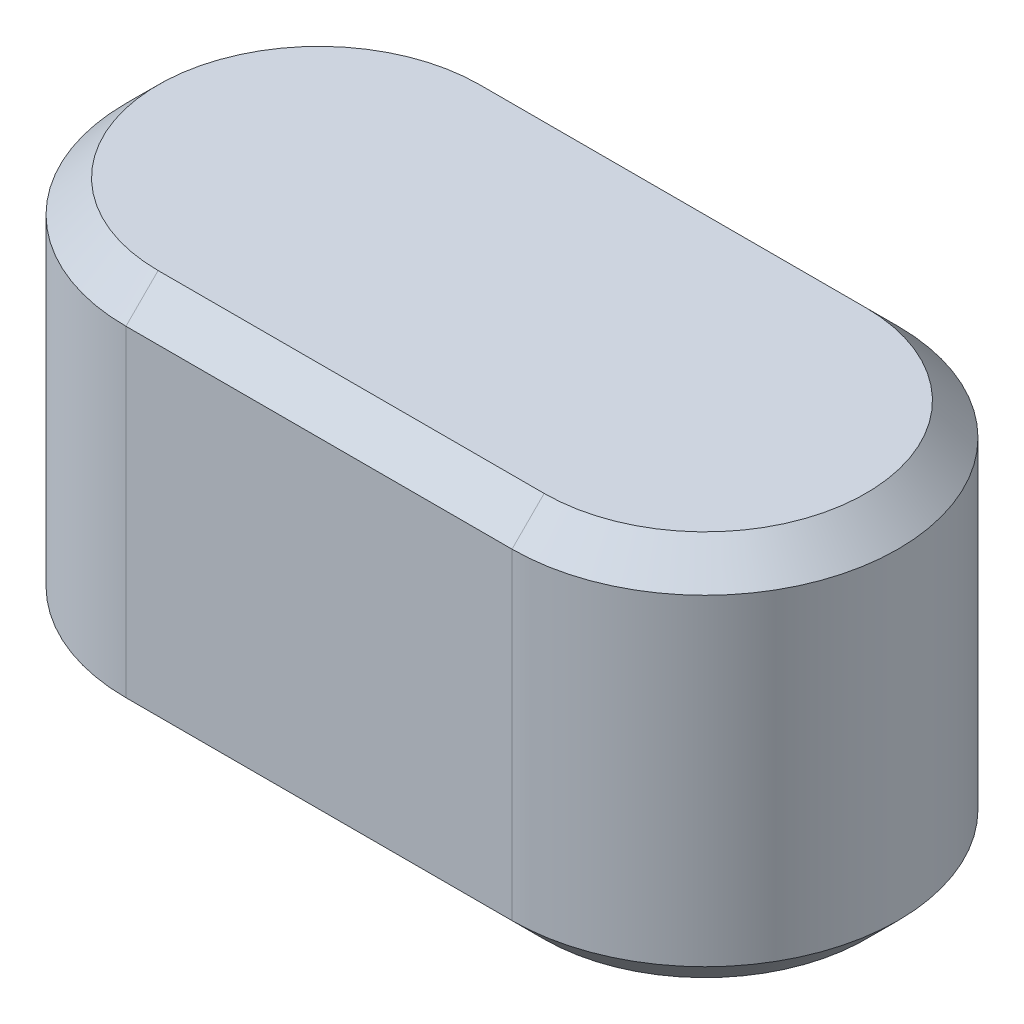
ISO-10303-21;
HEADER;
FILE_DESCRIPTION(('STEP AP214'),'2;1');
FILE_NAME('part.step','',(''),(''),'','','');
FILE_SCHEMA(('AUTOMOTIVE_DESIGN { 1 0 10303 214 1 1 1 1 }'));
ENDSEC;
DATA;
#1=APPLICATION_CONTEXT('core data for automotive mechanical design processes');
#2=APPLICATION_PROTOCOL_DEFINITION('international standard','automotive_design',2000,#1);
#3=PRODUCT_CONTEXT('',#1,'mechanical');
#4=PRODUCT('Part','Part','',(#3));
#5=PRODUCT_RELATED_PRODUCT_CATEGORY('part','',(#4));
#6=PRODUCT_DEFINITION_FORMATION('','',#4);
#7=PRODUCT_DEFINITION_CONTEXT('part definition',#1,'design');
#8=PRODUCT_DEFINITION('design','',#6,#7);
#9=PRODUCT_DEFINITION_SHAPE('','',#8);
#10=(LENGTH_UNIT() NAMED_UNIT(*) SI_UNIT(.MILLI.,.METRE.));
#11=(NAMED_UNIT(*) PLANE_ANGLE_UNIT() SI_UNIT($,.RADIAN.));
#12=(NAMED_UNIT(*) SI_UNIT($,.STERADIAN.) SOLID_ANGLE_UNIT());
#13=UNCERTAINTY_MEASURE_WITH_UNIT(LENGTH_MEASURE(1.E-05),#10,'distance_accuracy_value','');
#14=(GEOMETRIC_REPRESENTATION_CONTEXT(3) GLOBAL_UNCERTAINTY_ASSIGNED_CONTEXT((#13)) GLOBAL_UNIT_ASSIGNED_CONTEXT((#10,
#11,#12)) REPRESENTATION_CONTEXT('',''));
#15=CARTESIAN_POINT('',(0.,0.,0.));
#16=DIRECTION('',(0.,0.,1.));
#17=DIRECTION('',(1.,0.,0.));
#18=AXIS2_PLACEMENT_3D('',#15,#16,#17);
#19=CARTESIAN_POINT('',(0.,6.,0.));
#20=DIRECTION('',(0.,-1.,0.));
#21=DIRECTION('',(0.,0.,-1.));
#22=AXIS2_PLACEMENT_3D('',#19,#20,#21);
#23=CYLINDRICAL_SURFACE('',#22,3.);
#24=DIRECTION('',(0.,-1.,0.));
#25=VECTOR('',#24,1.);
#26=CARTESIAN_POINT('',(0.,6.,-3.));
#27=LINE('',#26,#25);
#28=CARTESIAN_POINT('',(0.,5.5,-3.));
#29=VERTEX_POINT('',#28);
#30=CARTESIAN_POINT('',(0.,0.500000000000002,-3.));
#31=VERTEX_POINT('',#30);
#32=EDGE_CURVE('E151',#29,#31,#27,.T.);
#33=ORIENTED_EDGE('',*,*,#32,.T.);
#34=CARTESIAN_POINT('',(0.,0.500000000000002,0.));
#35=DIRECTION('',(0.,1.,0.));
#36=DIRECTION('',(0.,0.,1.));
#37=AXIS2_PLACEMENT_3D('',#34,#35,#36);
#38=CIRCLE('',#37,3.);
#39=CARTESIAN_POINT('',(0.,0.500000000000002,3.));
#40=VERTEX_POINT('',#39);
#41=EDGE_CURVE('E160',#31,#40,#38,.T.);
#42=ORIENTED_EDGE('',*,*,#41,.T.);
#43=DIRECTION('',(0.,-1.,0.));
#44=VECTOR('',#43,1.);
#45=CARTESIAN_POINT('',(0.,6.,3.));
#46=LINE('',#45,#44);
#47=CARTESIAN_POINT('',(0.,5.5,3.));
#48=VERTEX_POINT('',#47);
#49=EDGE_CURVE('E129',#48,#40,#46,.T.);
#50=ORIENTED_EDGE('',*,*,#49,.F.);
#51=CARTESIAN_POINT('',(0.,5.5,0.));
#52=DIRECTION('',(0.,1.,0.));
#53=DIRECTION('',(0.,0.,1.));
#54=AXIS2_PLACEMENT_3D('',#51,#52,#53);
#55=CIRCLE('',#54,3.);
#56=EDGE_CURVE('E162',#48,#29,#55,.F.);
#57=ORIENTED_EDGE('',*,*,#56,.T.);
#58=EDGE_LOOP('',(#33,#42,#50,#57));
#59=FACE_BOUND('',#58,.T.);
#60=ADVANCED_FACE('F41',(#59),#23,.T.);
#61=CARTESIAN_POINT('',(0.,6.,3.));
#62=DIRECTION('',(0.,0.,-1.));
#63=DIRECTION('',(-1.,0.,0.));
#64=AXIS2_PLACEMENT_3D('',#61,#62,#63);
#65=PLANE('',#64);
#66=ORIENTED_EDGE('',*,*,#49,.T.);
#67=DIRECTION('',(1.,0.,0.));
#68=VECTOR('',#67,1.);
#69=CARTESIAN_POINT('',(0.,0.500000000000002,3.));
#70=LINE('',#69,#68);
#71=CARTESIAN_POINT('',(6.,0.500000000000002,3.));
#72=VERTEX_POINT('',#71);
#73=EDGE_CURVE('E128',#40,#72,#70,.T.);
#74=ORIENTED_EDGE('',*,*,#73,.T.);
#75=DIRECTION('',(0.,-1.,0.));
#76=VECTOR('',#75,1.);
#77=CARTESIAN_POINT('',(6.,6.,3.));
#78=LINE('',#77,#76);
#79=CARTESIAN_POINT('',(6.,5.5,3.));
#80=VERTEX_POINT('',#79);
#81=EDGE_CURVE('E111',#80,#72,#78,.T.);
#82=ORIENTED_EDGE('',*,*,#81,.F.);
#83=DIRECTION('',(-1.,0.,0.));
#84=VECTOR('',#83,1.);
#85=CARTESIAN_POINT('',(0.,5.5,3.));
#86=LINE('',#85,#84);
#87=EDGE_CURVE('E125',#80,#48,#86,.T.);
#88=ORIENTED_EDGE('',*,*,#87,.T.);
#89=EDGE_LOOP('',(#66,#74,#82,#88));
#90=FACE_BOUND('',#89,.T.);
#91=ADVANCED_FACE('F124',(#90),#65,.F.);
#92=CARTESIAN_POINT('',(6.,6.,0.));
#93=DIRECTION('',(0.,-1.,0.));
#94=DIRECTION('',(0.,0.,-1.));
#95=AXIS2_PLACEMENT_3D('',#92,#93,#94);
#96=CYLINDRICAL_SURFACE('',#95,3.);
#97=ORIENTED_EDGE('',*,*,#81,.T.);
#98=CARTESIAN_POINT('',(6.,0.500000000000002,0.));
#99=DIRECTION('',(0.,1.,0.));
#100=DIRECTION('',(0.,0.,1.));
#101=AXIS2_PLACEMENT_3D('',#98,#99,#100);
#102=CIRCLE('',#101,3.);
#103=CARTESIAN_POINT('',(6.,0.500000000000002,-3.));
#104=VERTEX_POINT('',#103);
#105=EDGE_CURVE('E117',#72,#104,#102,.T.);
#106=ORIENTED_EDGE('',*,*,#105,.T.);
#107=DIRECTION('',(0.,-1.,0.));
#108=VECTOR('',#107,1.);
#109=CARTESIAN_POINT('',(6.,6.,-3.));
#110=LINE('',#109,#108);
#111=CARTESIAN_POINT('',(6.,5.5,-3.));
#112=VERTEX_POINT('',#111);
#113=EDGE_CURVE('E113',#112,#104,#110,.T.);
#114=ORIENTED_EDGE('',*,*,#113,.F.);
#115=CARTESIAN_POINT('',(6.,5.5,0.));
#116=DIRECTION('',(0.,1.,0.));
#117=DIRECTION('',(0.,0.,1.));
#118=AXIS2_PLACEMENT_3D('',#115,#116,#117);
#119=CIRCLE('',#118,3.);
#120=EDGE_CURVE('E108',#112,#80,#119,.F.);
#121=ORIENTED_EDGE('',*,*,#120,.T.);
#122=EDGE_LOOP('',(#97,#106,#114,#121));
#123=FACE_BOUND('',#122,.T.);
#124=ADVANCED_FACE('F110',(#123),#96,.T.);
#125=CARTESIAN_POINT('',(0.,6.,-3.));
#126=DIRECTION('',(0.,0.,1.));
#127=DIRECTION('',(1.,0.,0.));
#128=AXIS2_PLACEMENT_3D('',#125,#126,#127);
#129=PLANE('',#128);
#130=ORIENTED_EDGE('',*,*,#113,.T.);
#131=DIRECTION('',(-1.,0.,0.));
#132=VECTOR('',#131,1.);
#133=CARTESIAN_POINT('',(0.,0.500000000000002,-3.));
#134=LINE('',#133,#132);
#135=EDGE_CURVE('E164',#104,#31,#134,.T.);
#136=ORIENTED_EDGE('',*,*,#135,.T.);
#137=ORIENTED_EDGE('',*,*,#32,.F.);
#138=DIRECTION('',(1.,0.,0.));
#139=VECTOR('',#138,1.);
#140=CARTESIAN_POINT('',(6.,5.5,-3.));
#141=LINE('',#140,#139);
#142=EDGE_CURVE('E166',#29,#112,#141,.T.);
#143=ORIENTED_EDGE('',*,*,#142,.T.);
#144=EDGE_LOOP('',(#130,#136,#137,#143));
#145=FACE_BOUND('',#144,.T.);
#146=ADVANCED_FACE('F204',(#145),#129,.F.);
#147=CARTESIAN_POINT('',(0.,6.,0.));
#148=DIRECTION('',(0.,1.,0.));
#149=DIRECTION('',(0.,0.,1.));
#150=AXIS2_PLACEMENT_3D('',#147,#148,#149);
#151=PLANE('',#150);
#152=CARTESIAN_POINT('',(6.,6.,0.));
#153=DIRECTION('',(0.,1.,0.));
#154=DIRECTION('',(0.,0.,1.));
#155=AXIS2_PLACEMENT_3D('',#152,#153,#154);
#156=CIRCLE('',#155,2.5);
#157=CARTESIAN_POINT('',(6.,6.,2.5));
#158=VERTEX_POINT('',#157);
#159=CARTESIAN_POINT('',(6.,6.,-2.5));
#160=VERTEX_POINT('',#159);
#161=EDGE_CURVE('E51',#158,#160,#156,.T.);
#162=ORIENTED_EDGE('',*,*,#161,.T.);
#163=DIRECTION('',(-1.,0.,0.));
#164=VECTOR('',#163,1.);
#165=CARTESIAN_POINT('',(0.,6.,-2.5));
#166=LINE('',#165,#164);
#167=CARTESIAN_POINT('',(0.,6.,-2.5));
#168=VERTEX_POINT('',#167);
#169=EDGE_CURVE('E11',#160,#168,#166,.T.);
#170=ORIENTED_EDGE('',*,*,#169,.T.);
#171=CARTESIAN_POINT('',(0.,6.,0.));
#172=DIRECTION('',(0.,1.,0.));
#173=DIRECTION('',(0.,0.,1.));
#174=AXIS2_PLACEMENT_3D('',#171,#172,#173);
#175=CIRCLE('',#174,2.5);
#176=CARTESIAN_POINT('',(0.,6.,2.5));
#177=VERTEX_POINT('',#176);
#178=EDGE_CURVE('E158',#168,#177,#175,.T.);
#179=ORIENTED_EDGE('',*,*,#178,.T.);
#180=DIRECTION('',(1.,0.,0.));
#181=VECTOR('',#180,1.);
#182=CARTESIAN_POINT('',(6.,6.,2.5));
#183=LINE('',#182,#181);
#184=EDGE_CURVE('E62',#177,#158,#183,.T.);
#185=ORIENTED_EDGE('',*,*,#184,.T.);
#186=EDGE_LOOP('',(#162,#170,#179,#185));
#187=FACE_BOUND('',#186,.T.);
#188=ADVANCED_FACE('F210',(#187),#151,.T.);
#189=CARTESIAN_POINT('',(0.,0.,0.));
#190=DIRECTION('',(0.,1.,0.));
#191=DIRECTION('',(0.,0.,1.));
#192=AXIS2_PLACEMENT_3D('',#189,#190,#191);
#193=PLANE('',#192);
#194=CARTESIAN_POINT('',(6.,0.,0.));
#195=DIRECTION('',(0.,1.,0.));
#196=DIRECTION('',(0.,0.,1.));
#197=AXIS2_PLACEMENT_3D('',#194,#195,#196);
#198=CIRCLE('',#197,2.5);
#199=CARTESIAN_POINT('',(6.,0.,-2.5));
#200=VERTEX_POINT('',#199);
#201=CARTESIAN_POINT('',(6.,0.,2.5));
#202=VERTEX_POINT('',#201);
#203=EDGE_CURVE('E171',#200,#202,#198,.F.);
#204=ORIENTED_EDGE('',*,*,#203,.T.);
#205=DIRECTION('',(-1.,0.,0.));
#206=VECTOR('',#205,1.);
#207=CARTESIAN_POINT('',(0.,0.,2.5));
#208=LINE('',#207,#206);
#209=CARTESIAN_POINT('',(0.,0.,2.5));
#210=VERTEX_POINT('',#209);
#211=EDGE_CURVE('E118',#202,#210,#208,.T.);
#212=ORIENTED_EDGE('',*,*,#211,.T.);
#213=CARTESIAN_POINT('',(0.,0.,0.));
#214=DIRECTION('',(0.,1.,0.));
#215=DIRECTION('',(0.,0.,1.));
#216=AXIS2_PLACEMENT_3D('',#213,#214,#215);
#217=CIRCLE('',#216,2.5);
#218=CARTESIAN_POINT('',(0.,0.,-2.5));
#219=VERTEX_POINT('',#218);
#220=EDGE_CURVE('E175',#210,#219,#217,.F.);
#221=ORIENTED_EDGE('',*,*,#220,.T.);
#222=DIRECTION('',(1.,0.,0.));
#223=VECTOR('',#222,1.);
#224=CARTESIAN_POINT('',(0.,0.,-2.5));
#225=LINE('',#224,#223);
#226=EDGE_CURVE('E173',#219,#200,#225,.T.);
#227=ORIENTED_EDGE('',*,*,#226,.T.);
#228=EDGE_LOOP('',(#204,#212,#221,#227));
#229=FACE_BOUND('',#228,.T.);
#230=ADVANCED_FACE('F212',(#229),#193,.F.);
#231=CARTESIAN_POINT('',(0.,0.500000000000002,-3.));
#232=DIRECTION('',(0.,0.707106781186548,0.707106781186548));
#233=DIRECTION('',(-1.,0.,0.));
#234=AXIS2_PLACEMENT_3D('',#231,#232,#233);
#235=PLANE('',#234);
#236=DIRECTION('',(0.,0.707106781186548,-0.707106781186548));
#237=VECTOR('',#236,1.);
#238=CARTESIAN_POINT('',(6.,0.,-2.5));
#239=LINE('',#238,#237);
#240=EDGE_CURVE('E152',#200,#104,#239,.T.);
#241=ORIENTED_EDGE('',*,*,#240,.F.);
#242=ORIENTED_EDGE('',*,*,#226,.F.);
#243=DIRECTION('',(0.,-0.707106781186548,0.707106781186548));
#244=VECTOR('',#243,1.);
#245=CARTESIAN_POINT('',(0.,0.500000000000002,-3.));
#246=LINE('',#245,#244);
#247=EDGE_CURVE('E148',#31,#219,#246,.T.);
#248=ORIENTED_EDGE('',*,*,#247,.F.);
#249=ORIENTED_EDGE('',*,*,#135,.F.);
#250=EDGE_LOOP('',(#241,#242,#248,#249));
#251=FACE_BOUND('',#250,.T.);
#252=ADVANCED_FACE('F191',(#251),#235,.F.);
#253=CARTESIAN_POINT('',(0.,0.500000000000002,0.));
#254=DIRECTION('',(0.,1.,0.));
#255=DIRECTION('',(0.,0.,1.));
#256=AXIS2_PLACEMENT_3D('',#253,#254,#255);
#257=CONICAL_SURFACE('',#256,3.,0.785398163397448);
#258=ORIENTED_EDGE('',*,*,#247,.T.);
#259=ORIENTED_EDGE('',*,*,#220,.F.);
#260=DIRECTION('',(0.,-0.707106781186548,-0.707106781186548));
#261=VECTOR('',#260,1.);
#262=CARTESIAN_POINT('',(0.,0.500000000000002,3.));
#263=LINE('',#262,#261);
#264=EDGE_CURVE('E139',#40,#210,#263,.T.);
#265=ORIENTED_EDGE('',*,*,#264,.F.);
#266=ORIENTED_EDGE('',*,*,#41,.F.);
#267=EDGE_LOOP('',(#258,#259,#265,#266));
#268=FACE_BOUND('',#267,.T.);
#269=ADVANCED_FACE('F195',(#268),#257,.T.);
#270=CARTESIAN_POINT('',(6.,0.500000000000002,0.));
#271=DIRECTION('',(0.,1.,0.));
#272=DIRECTION('',(0.,0.,1.));
#273=AXIS2_PLACEMENT_3D('',#270,#271,#272);
#274=CONICAL_SURFACE('',#273,3.,0.785398163397448);
#275=ORIENTED_EDGE('',*,*,#240,.T.);
#276=ORIENTED_EDGE('',*,*,#105,.F.);
#277=DIRECTION('',(0.,0.707106781186548,0.707106781186548));
#278=VECTOR('',#277,1.);
#279=CARTESIAN_POINT('',(6.,0.,2.5));
#280=LINE('',#279,#278);
#281=EDGE_CURVE('E138',#202,#72,#280,.T.);
#282=ORIENTED_EDGE('',*,*,#281,.F.);
#283=ORIENTED_EDGE('',*,*,#203,.F.);
#284=EDGE_LOOP('',(#275,#276,#282,#283));
#285=FACE_BOUND('',#284,.T.);
#286=ADVANCED_FACE('F203',(#285),#274,.T.);
#287=CARTESIAN_POINT('',(0.,0.500000000000002,3.));
#288=DIRECTION('',(0.,0.707106781186548,-0.707106781186548));
#289=DIRECTION('',(1.,0.,0.));
#290=AXIS2_PLACEMENT_3D('',#287,#288,#289);
#291=PLANE('',#290);
#292=ORIENTED_EDGE('',*,*,#264,.T.);
#293=ORIENTED_EDGE('',*,*,#211,.F.);
#294=ORIENTED_EDGE('',*,*,#281,.T.);
#295=ORIENTED_EDGE('',*,*,#73,.F.);
#296=EDGE_LOOP('',(#292,#293,#294,#295));
#297=FACE_BOUND('',#296,.T.);
#298=ADVANCED_FACE('F198',(#297),#291,.F.);
#299=CARTESIAN_POINT('',(0.,6.,2.5));
#300=DIRECTION('',(0.,0.707106781186546,0.707106781186549));
#301=DIRECTION('',(-1.,0.,0.));
#302=AXIS2_PLACEMENT_3D('',#299,#300,#301);
#303=PLANE('',#302);
#304=DIRECTION('',(0.,0.707106781186549,-0.707106781186546));
#305=VECTOR('',#304,1.);
#306=CARTESIAN_POINT('',(0.,5.5,3.));
#307=LINE('',#306,#305);
#308=EDGE_CURVE('E134',#48,#177,#307,.T.);
#309=ORIENTED_EDGE('',*,*,#308,.F.);
#310=ORIENTED_EDGE('',*,*,#87,.F.);
#311=DIRECTION('',(0.,-0.707106781186549,0.707106781186546));
#312=VECTOR('',#311,1.);
#313=CARTESIAN_POINT('',(6.,6.,2.5));
#314=LINE('',#313,#312);
#315=EDGE_CURVE('E46',#158,#80,#314,.T.);
#316=ORIENTED_EDGE('',*,*,#315,.F.);
#317=ORIENTED_EDGE('',*,*,#184,.F.);
#318=EDGE_LOOP('',(#309,#310,#316,#317));
#319=FACE_BOUND('',#318,.T.);
#320=ADVANCED_FACE('F44',(#319),#303,.T.);
#321=CARTESIAN_POINT('',(6.,6.,0.));
#322=DIRECTION('',(0.,-1.,0.));
#323=DIRECTION('',(0.,0.,-1.));
#324=AXIS2_PLACEMENT_3D('',#321,#322,#323);
#325=CONICAL_SURFACE('',#324,2.5,0.785398163397447);
#326=ORIENTED_EDGE('',*,*,#315,.T.);
#327=ORIENTED_EDGE('',*,*,#120,.F.);
#328=DIRECTION('',(0.,-0.707106781186549,-0.707106781186546));
#329=VECTOR('',#328,1.);
#330=CARTESIAN_POINT('',(6.,6.,-2.5));
#331=LINE('',#330,#329);
#332=EDGE_CURVE('E141',#160,#112,#331,.T.);
#333=ORIENTED_EDGE('',*,*,#332,.F.);
#334=ORIENTED_EDGE('',*,*,#161,.F.);
#335=EDGE_LOOP('',(#326,#327,#333,#334));
#336=FACE_BOUND('',#335,.T.);
#337=ADVANCED_FACE('F137',(#336),#325,.T.);
#338=CARTESIAN_POINT('',(0.,6.,0.));
#339=DIRECTION('',(0.,-1.,0.));
#340=DIRECTION('',(0.,0.,-1.));
#341=AXIS2_PLACEMENT_3D('',#338,#339,#340);
#342=CONICAL_SURFACE('',#341,2.5,0.785398163397447);
#343=ORIENTED_EDGE('',*,*,#308,.T.);
#344=ORIENTED_EDGE('',*,*,#178,.F.);
#345=DIRECTION('',(0.,0.707106781186549,0.707106781186546));
#346=VECTOR('',#345,1.);
#347=CARTESIAN_POINT('',(0.,5.5,-3.));
#348=LINE('',#347,#346);
#349=EDGE_CURVE('E144',#29,#168,#348,.T.);
#350=ORIENTED_EDGE('',*,*,#349,.F.);
#351=ORIENTED_EDGE('',*,*,#56,.F.);
#352=EDGE_LOOP('',(#343,#344,#350,#351));
#353=FACE_BOUND('',#352,.T.);
#354=ADVANCED_FACE('F209',(#353),#342,.T.);
#355=CARTESIAN_POINT('',(0.,6.,-2.5));
#356=DIRECTION('',(0.,0.707106781186546,-0.707106781186549));
#357=DIRECTION('',(1.,0.,0.));
#358=AXIS2_PLACEMENT_3D('',#355,#356,#357);
#359=PLANE('',#358);
#360=ORIENTED_EDGE('',*,*,#332,.T.);
#361=ORIENTED_EDGE('',*,*,#142,.F.);
#362=ORIENTED_EDGE('',*,*,#349,.T.);
#363=ORIENTED_EDGE('',*,*,#169,.F.);
#364=EDGE_LOOP('',(#360,#361,#362,#363));
#365=FACE_BOUND('',#364,.T.);
#366=ADVANCED_FACE('F207',(#365),#359,.T.);
#367=CLOSED_SHELL('',(#60,#91,#124,#146,#188,#230,#252,#269,#286,#298,#320,#337,#354,#366));
#368=MANIFOLD_SOLID_BREP('B2',#367);
#369=ADVANCED_BREP_SHAPE_REPRESENTATION('',(#18,#368),#14);
#370=SHAPE_DEFINITION_REPRESENTATION(#9,#369);
ENDSEC;
END-ISO-10303-21;
